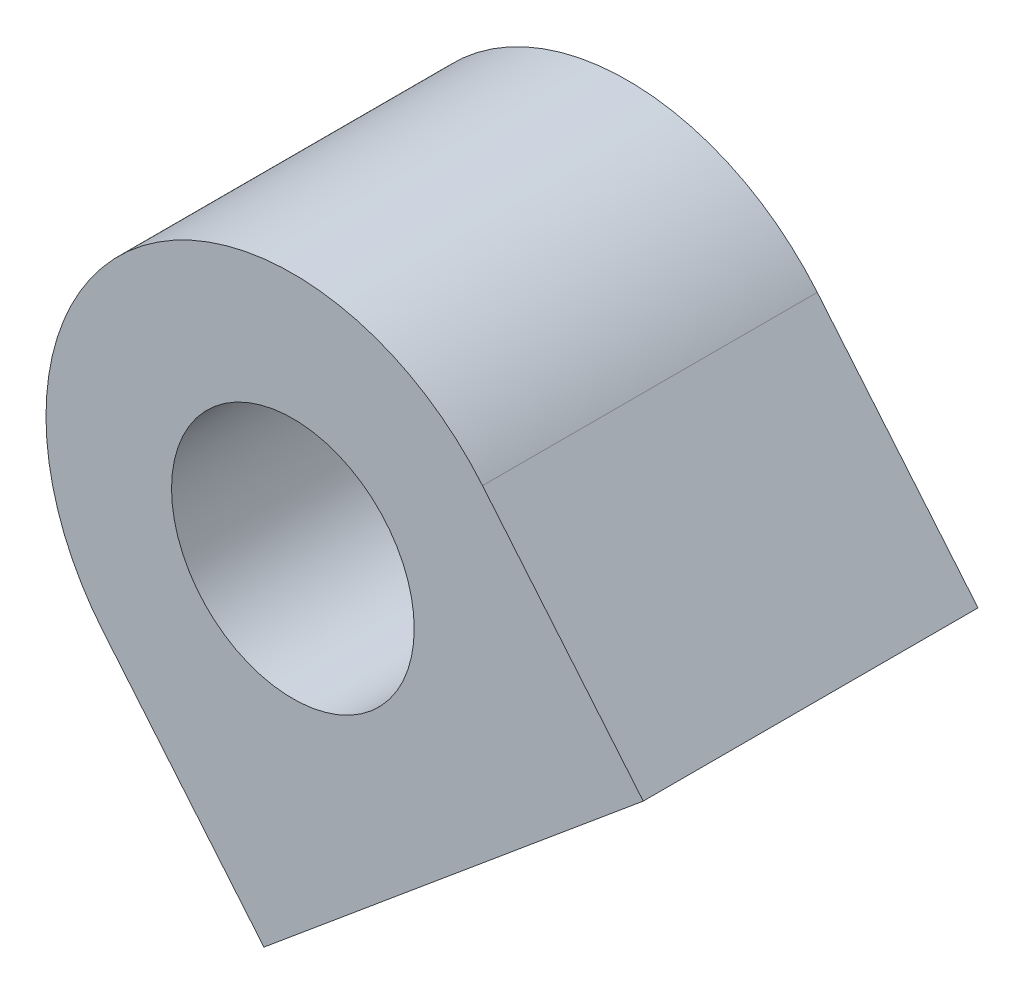
ISO-10303-21;
HEADER;
FILE_DESCRIPTION(('STEP AP214'),'2;1');
FILE_NAME('part.step','',(''),(''),'','','');
FILE_SCHEMA(('AUTOMOTIVE_DESIGN { 1 0 10303 214 1 1 1 1 }'));
ENDSEC;
DATA;
#1=APPLICATION_CONTEXT('core data for automotive mechanical design processes');
#2=APPLICATION_PROTOCOL_DEFINITION('international standard','automotive_design',2000,#1);
#3=PRODUCT_CONTEXT('',#1,'mechanical');
#4=PRODUCT('Part','Part','',(#3));
#5=PRODUCT_RELATED_PRODUCT_CATEGORY('part','',(#4));
#6=PRODUCT_DEFINITION_FORMATION('','',#4);
#7=PRODUCT_DEFINITION_CONTEXT('part definition',#1,'design');
#8=PRODUCT_DEFINITION('design','',#6,#7);
#9=PRODUCT_DEFINITION_SHAPE('','',#8);
#10=(LENGTH_UNIT() NAMED_UNIT(*) SI_UNIT(.MILLI.,.METRE.));
#11=(NAMED_UNIT(*) PLANE_ANGLE_UNIT() SI_UNIT($,.RADIAN.));
#12=(NAMED_UNIT(*) SI_UNIT($,.STERADIAN.) SOLID_ANGLE_UNIT());
#13=UNCERTAINTY_MEASURE_WITH_UNIT(LENGTH_MEASURE(1.E-05),#10,'distance_accuracy_value','');
#14=(GEOMETRIC_REPRESENTATION_CONTEXT(3) GLOBAL_UNCERTAINTY_ASSIGNED_CONTEXT((#13)) GLOBAL_UNIT_ASSIGNED_CONTEXT((#10,
#11,#12)) REPRESENTATION_CONTEXT('',''));
#15=CARTESIAN_POINT('',(0.,0.,0.));
#16=DIRECTION('',(0.,0.,1.));
#17=DIRECTION('',(1.,0.,0.));
#18=AXIS2_PLACEMENT_3D('',#15,#16,#17);
#19=CARTESIAN_POINT('',(0.,0.,5.));
#20=DIRECTION('',(0.,0.,-1.));
#21=DIRECTION('',(-1.,0.,0.));
#22=AXIS2_PLACEMENT_3D('',#19,#20,#21);
#23=PLANE('',#22);
#24=DIRECTION('',(0.768221279597376,0.64018439966448,0.));
#25=VECTOR('',#24,1.);
#26=CARTESIAN_POINT('',(25.9855621266812,-31.1826745520174,5.));
#27=LINE('',#26,#25);
#28=CARTESIAN_POINT('',(38.2074031507691,-20.9978070319442,5.));
#29=VERTEX_POINT('',#28);
#30=CARTESIAN_POINT('',(42.7399087003936,-17.2207190739238,5.));
#31=VERTEX_POINT('',#30);
#32=EDGE_CURVE('E44',#29,#31,#27,.T.);
#33=ORIENTED_EDGE('',*,*,#32,.T.);
#34=DIRECTION('',(-0.64018439966448,0.768221279597376,0.));
#35=VECTOR('',#34,1.);
#36=CARTESIAN_POINT('',(16.7543465737124,13.9619554780937,5.));
#37=LINE('',#36,#35);
#38=CARTESIAN_POINT('',(40.8193555014001,-14.9160552351317,5.));
#39=VERTEX_POINT('',#38);
#40=EDGE_CURVE('E82',#31,#39,#37,.T.);
#41=ORIENTED_EDGE('',*,*,#40,.T.);
#42=CARTESIAN_POINT('',(38.5531027265879,-16.8045992141419,5.));
#43=DIRECTION('',(0.,0.,-1.));
#44=DIRECTION('',(-1.,0.,0.));
#45=AXIS2_PLACEMENT_3D('',#42,#43,#44);
#46=CIRCLE('',#45,2.95);
#47=CARTESIAN_POINT('',(36.2868499517756,-18.6931431931521,5.));
#48=VERTEX_POINT('',#47);
#49=EDGE_CURVE('E87',#39,#48,#46,.F.);
#50=ORIENTED_EDGE('',*,*,#49,.T.);
#51=DIRECTION('',(-0.64018439966448,0.768221279597376,0.));
#52=VECTOR('',#51,1.);
#53=CARTESIAN_POINT('',(12.2218410240879,10.1848675200732,5.));
#54=LINE('',#53,#52);
#55=EDGE_CURVE('E90',#29,#48,#54,.T.);
#56=ORIENTED_EDGE('',*,*,#55,.F.);
#57=EDGE_LOOP('',(#33,#41,#50,#56));
#58=FACE_BOUND('',#57,.T.);
#59=CARTESIAN_POINT('',(38.5531027265879,-16.8045992141419,5.));
#60=DIRECTION('',(0.,0.,-1.));
#61=DIRECTION('',(-1.,0.,0.));
#62=AXIS2_PLACEMENT_3D('',#59,#60,#61);
#63=CIRCLE('',#62,1.45);
#64=CARTESIAN_POINT('',(37.1031027265879,-16.8045992141419,5.));
#65=VERTEX_POINT('',#64);
#66=EDGE_CURVE('E105',#65,#65,#63,.F.);
#67=ORIENTED_EDGE('',*,*,#66,.F.);
#68=EDGE_LOOP('',(#67));
#69=FACE_BOUND('',#68,.T.);
#70=ADVANCED_FACE('F41',(#58,#69),#23,.F.);
#71=CARTESIAN_POINT('',(38.5531027265879,-16.8045992141419,17.));
#72=DIRECTION('',(0.,0.,-1.));
#73=DIRECTION('',(-1.,0.,0.));
#74=AXIS2_PLACEMENT_3D('',#71,#72,#73);
#75=CYLINDRICAL_SURFACE('',#74,2.95);
#76=ORIENTED_EDGE('',*,*,#49,.F.);
#77=DIRECTION('',(0.,0.,-1.));
#78=VECTOR('',#77,1.);
#79=CARTESIAN_POINT('',(40.8193555014001,-14.9160552351317,17.));
#80=LINE('',#79,#78);
#81=CARTESIAN_POINT('',(40.8193555014001,-14.9160552351317,1.));
#82=VERTEX_POINT('',#81);
#83=EDGE_CURVE('E57',#39,#82,#80,.T.);
#84=ORIENTED_EDGE('',*,*,#83,.T.);
#85=CARTESIAN_POINT('',(38.5531027265879,-16.8045992141419,1.));
#86=DIRECTION('',(0.,0.,-1.));
#87=DIRECTION('',(-1.,0.,0.));
#88=AXIS2_PLACEMENT_3D('',#85,#86,#87);
#89=CIRCLE('',#88,2.95);
#90=CARTESIAN_POINT('',(36.2868499517756,-18.6931431931521,1.));
#91=VERTEX_POINT('',#90);
#92=EDGE_CURVE('E49',#91,#82,#89,.T.);
#93=ORIENTED_EDGE('',*,*,#92,.F.);
#94=DIRECTION('',(0.,0.,-1.));
#95=VECTOR('',#94,1.);
#96=CARTESIAN_POINT('',(36.2868499517756,-18.6931431931521,17.));
#97=LINE('',#96,#95);
#98=EDGE_CURVE('E101',#48,#91,#97,.T.);
#99=ORIENTED_EDGE('',*,*,#98,.F.);
#100=EDGE_LOOP('',(#76,#84,#93,#99));
#101=FACE_BOUND('',#100,.T.);
#102=ADVANCED_FACE('F122',(#101),#75,.T.);
#103=CARTESIAN_POINT('',(16.7543465737124,13.9619554780937,17.));
#104=DIRECTION('',(0.768221279597376,0.64018439966448,0.));
#105=DIRECTION('',(-0.64018439966448,0.768221279597376,0.));
#106=AXIS2_PLACEMENT_3D('',#103,#104,#105);
#107=PLANE('',#106);
#108=ORIENTED_EDGE('',*,*,#40,.F.);
#109=DIRECTION('',(0.,0.,-1.));
#110=VECTOR('',#109,1.);
#111=CARTESIAN_POINT('',(42.7399087003936,-17.2207190739238,17.));
#112=LINE('',#111,#110);
#113=CARTESIAN_POINT('',(42.7399087003936,-17.2207190739238,1.));
#114=VERTEX_POINT('',#113);
#115=EDGE_CURVE('E64',#31,#114,#112,.T.);
#116=ORIENTED_EDGE('',*,*,#115,.T.);
#117=DIRECTION('',(0.64018439966448,-0.768221279597376,0.));
#118=VECTOR('',#117,1.);
#119=CARTESIAN_POINT('',(16.7543465737124,13.9619554780937,1.));
#120=LINE('',#119,#118);
#121=EDGE_CURVE('E116',#82,#114,#120,.T.);
#122=ORIENTED_EDGE('',*,*,#121,.F.);
#123=ORIENTED_EDGE('',*,*,#83,.F.);
#124=EDGE_LOOP('',(#108,#116,#122,#123));
#125=FACE_BOUND('',#124,.T.);
#126=ADVANCED_FACE('F84',(#125),#107,.T.);
#127=CARTESIAN_POINT('',(0.,0.,1.));
#128=DIRECTION('',(0.,0.,-1.));
#129=DIRECTION('',(-1.,0.,0.));
#130=AXIS2_PLACEMENT_3D('',#127,#128,#129);
#131=PLANE('',#130);
#132=CARTESIAN_POINT('',(38.5531027265879,-16.8045992141419,1.));
#133=DIRECTION('',(0.,0.,-1.));
#134=DIRECTION('',(-1.,0.,0.));
#135=AXIS2_PLACEMENT_3D('',#132,#133,#134);
#136=CIRCLE('',#135,1.45);
#137=CARTESIAN_POINT('',(37.1031027265879,-16.8045992141419,1.));
#138=VERTEX_POINT('',#137);
#139=EDGE_CURVE('E11',#138,#138,#136,.T.);
#140=ORIENTED_EDGE('',*,*,#139,.F.);
#141=EDGE_LOOP('',(#140));
#142=FACE_BOUND('',#141,.T.);
#143=ORIENTED_EDGE('',*,*,#92,.T.);
#144=ORIENTED_EDGE('',*,*,#121,.T.);
#145=DIRECTION('',(0.768221279597376,0.64018439966448,0.));
#146=VECTOR('',#145,1.);
#147=CARTESIAN_POINT('',(25.9855621266812,-31.1826745520174,1.));
#148=LINE('',#147,#146);
#149=CARTESIAN_POINT('',(38.2074031507691,-20.9978070319442,1.));
#150=VERTEX_POINT('',#149);
#151=EDGE_CURVE('E96',#150,#114,#148,.T.);
#152=ORIENTED_EDGE('',*,*,#151,.F.);
#153=DIRECTION('',(0.640184399664479,-0.768221279597376,0.));
#154=VECTOR('',#153,1.);
#155=CARTESIAN_POINT('',(12.2218410240879,10.1848675200732,1.));
#156=LINE('',#155,#154);
#157=EDGE_CURVE('E99',#91,#150,#156,.T.);
#158=ORIENTED_EDGE('',*,*,#157,.F.);
#159=EDGE_LOOP('',(#143,#144,#152,#158));
#160=FACE_BOUND('',#159,.T.);
#161=ADVANCED_FACE('F121',(#142,#160),#131,.T.);
#162=CARTESIAN_POINT('',(12.2218410240879,10.1848675200732,17.));
#163=DIRECTION('',(0.768221279597376,0.640184399664479,0.));
#164=DIRECTION('',(-0.64018439966448,0.768221279597376,0.));
#165=AXIS2_PLACEMENT_3D('',#162,#163,#164);
#166=PLANE('',#165);
#167=DIRECTION('',(0.,0.,-1.));
#168=VECTOR('',#167,1.);
#169=CARTESIAN_POINT('',(38.2074031507691,-20.9978070319442,17.));
#170=LINE('',#169,#168);
#171=EDGE_CURVE('E97',#29,#150,#170,.T.);
#172=ORIENTED_EDGE('',*,*,#171,.F.);
#173=ORIENTED_EDGE('',*,*,#55,.T.);
#174=ORIENTED_EDGE('',*,*,#98,.T.);
#175=ORIENTED_EDGE('',*,*,#157,.T.);
#176=EDGE_LOOP('',(#172,#173,#174,#175));
#177=FACE_BOUND('',#176,.T.);
#178=ADVANCED_FACE('F124',(#177),#166,.F.);
#179=CARTESIAN_POINT('',(25.9855621266812,-31.1826745520174,17.));
#180=DIRECTION('',(-0.64018439966448,0.768221279597376,0.));
#181=DIRECTION('',(-0.768221279597376,-0.64018439966448,0.));
#182=AXIS2_PLACEMENT_3D('',#179,#180,#181);
#183=PLANE('',#182);
#184=ORIENTED_EDGE('',*,*,#32,.F.);
#185=ORIENTED_EDGE('',*,*,#171,.T.);
#186=ORIENTED_EDGE('',*,*,#151,.T.);
#187=ORIENTED_EDGE('',*,*,#115,.F.);
#188=EDGE_LOOP('',(#184,#185,#186,#187));
#189=FACE_BOUND('',#188,.T.);
#190=ADVANCED_FACE('F94',(#189),#183,.F.);
#191=CARTESIAN_POINT('',(38.5531027265879,-16.8045992141419,17.));
#192=DIRECTION('',(0.,0.,-1.));
#193=DIRECTION('',(-1.,0.,0.));
#194=AXIS2_PLACEMENT_3D('',#191,#192,#193);
#195=CYLINDRICAL_SURFACE('',#194,1.45);
#196=ORIENTED_EDGE('',*,*,#66,.T.);
#197=EDGE_LOOP('',(#196));
#198=FACE_BOUND('',#197,.T.);
#199=ORIENTED_EDGE('',*,*,#139,.T.);
#200=EDGE_LOOP('',(#199));
#201=FACE_BOUND('',#200,.T.);
#202=ADVANCED_FACE('F131',(#198,#201),#195,.F.);
#203=CLOSED_SHELL('',(#70,#102,#126,#161,#178,#190,#202));
#204=MANIFOLD_SOLID_BREP('B2',#203);
#205=ADVANCED_BREP_SHAPE_REPRESENTATION('',(#18,#204),#14);
#206=SHAPE_DEFINITION_REPRESENTATION(#9,#205);
ENDSEC;
END-ISO-10303-21;
